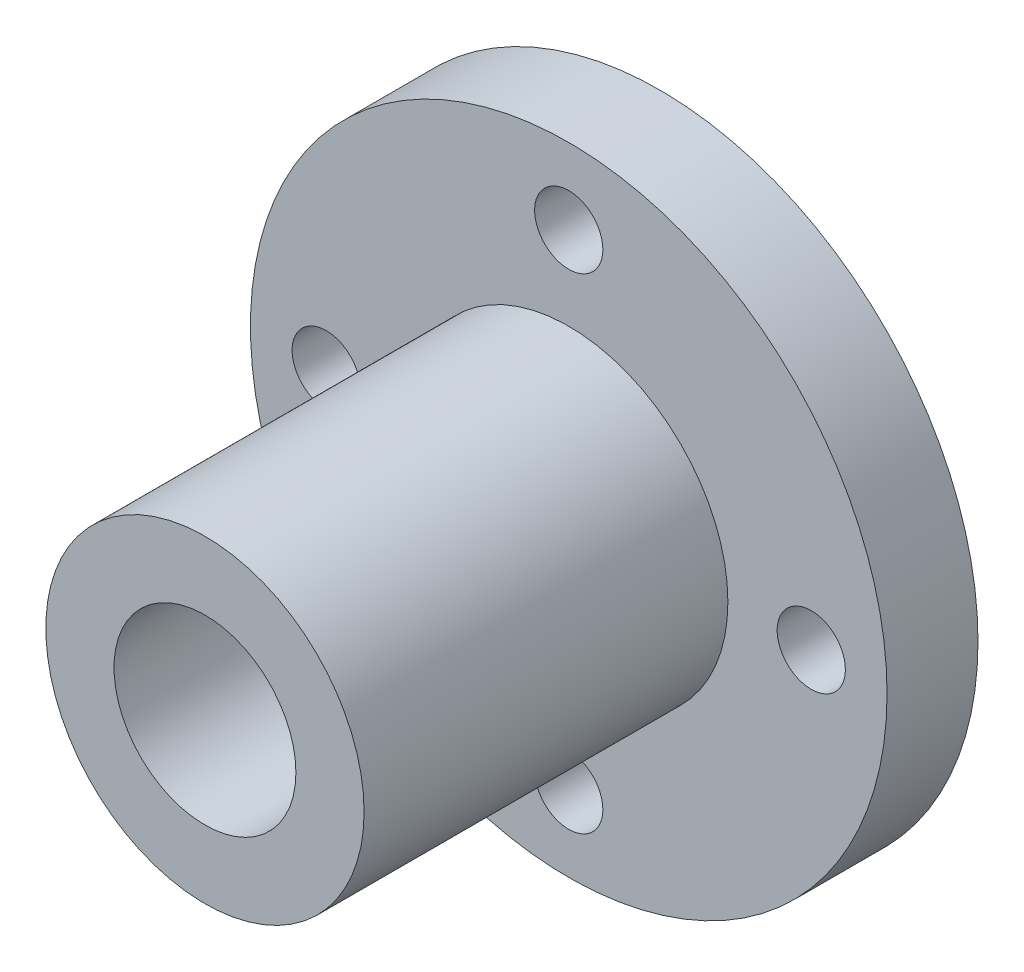
ISO-10303-21;
HEADER;
FILE_DESCRIPTION(('STEP AP214'),'2;1');
FILE_NAME('part.step','',(''),(''),'','','');
FILE_SCHEMA(('AUTOMOTIVE_DESIGN { 1 0 10303 214 1 1 1 1 }'));
ENDSEC;
DATA;
#1=APPLICATION_CONTEXT('core data for automotive mechanical design processes');
#2=APPLICATION_PROTOCOL_DEFINITION('international standard','automotive_design',2000,#1);
#3=PRODUCT_CONTEXT('',#1,'mechanical');
#4=PRODUCT('Part','Part','',(#3));
#5=PRODUCT_RELATED_PRODUCT_CATEGORY('part','',(#4));
#6=PRODUCT_DEFINITION_FORMATION('','',#4);
#7=PRODUCT_DEFINITION_CONTEXT('part definition',#1,'design');
#8=PRODUCT_DEFINITION('design','',#6,#7);
#9=PRODUCT_DEFINITION_SHAPE('','',#8);
#10=(LENGTH_UNIT() NAMED_UNIT(*) SI_UNIT(.MILLI.,.METRE.));
#11=(NAMED_UNIT(*) PLANE_ANGLE_UNIT() SI_UNIT($,.RADIAN.));
#12=(NAMED_UNIT(*) SI_UNIT($,.STERADIAN.) SOLID_ANGLE_UNIT());
#13=UNCERTAINTY_MEASURE_WITH_UNIT(LENGTH_MEASURE(1.E-05),#10,'distance_accuracy_value','');
#14=(GEOMETRIC_REPRESENTATION_CONTEXT(3) GLOBAL_UNCERTAINTY_ASSIGNED_CONTEXT((#13)) GLOBAL_UNIT_ASSIGNED_CONTEXT((#10,
#11,#12)) REPRESENTATION_CONTEXT('',''));
#15=CARTESIAN_POINT('',(0.,0.,0.));
#16=DIRECTION('',(0.,0.,1.));
#17=DIRECTION('',(1.,0.,0.));
#18=AXIS2_PLACEMENT_3D('',#15,#16,#17);
#19=CARTESIAN_POINT('',(0.,0.,6.));
#20=DIRECTION('',(0.,0.,-1.));
#21=DIRECTION('',(-1.,0.,0.));
#22=AXIS2_PLACEMENT_3D('',#19,#20,#21);
#23=CYLINDRICAL_SURFACE('',#22,21.);
#24=CARTESIAN_POINT('',(0.,0.,6.));
#25=DIRECTION('',(0.,0.,1.));
#26=DIRECTION('',(1.,0.,0.));
#27=AXIS2_PLACEMENT_3D('',#24,#25,#26);
#28=CIRCLE('',#27,21.);
#29=CARTESIAN_POINT('',(21.,0.,6.));
#30=VERTEX_POINT('',#29);
#31=EDGE_CURVE('E48',#30,#30,#28,.T.);
#32=ORIENTED_EDGE('',*,*,#31,.F.);
#33=EDGE_LOOP('',(#32));
#34=FACE_BOUND('',#33,.T.);
#35=CARTESIAN_POINT('',(0.,0.,0.));
#36=DIRECTION('',(0.,0.,1.));
#37=DIRECTION('',(1.,0.,0.));
#38=AXIS2_PLACEMENT_3D('',#35,#36,#37);
#39=CIRCLE('',#38,21.);
#40=CARTESIAN_POINT('',(21.,0.,0.));
#41=VERTEX_POINT('',#40);
#42=EDGE_CURVE('E43',#41,#41,#39,.T.);
#43=ORIENTED_EDGE('',*,*,#42,.T.);
#44=EDGE_LOOP('',(#43));
#45=FACE_BOUND('',#44,.T.);
#46=ADVANCED_FACE('F40',(#34,#45),#23,.T.);
#47=CARTESIAN_POINT('',(0.,0.,6.));
#48=DIRECTION('',(0.,0.,1.));
#49=DIRECTION('',(1.,0.,0.));
#50=AXIS2_PLACEMENT_3D('',#47,#48,#49);
#51=PLANE('',#50);
#52=CARTESIAN_POINT('',(-16.,0.,6.));
#53=DIRECTION('',(0.,0.,1.));
#54=DIRECTION('',(1.,0.,0.));
#55=AXIS2_PLACEMENT_3D('',#52,#53,#54);
#56=CIRCLE('',#55,2.25);
#57=CARTESIAN_POINT('',(-13.75,0.,6.));
#58=VERTEX_POINT('',#57);
#59=EDGE_CURVE('E92',#58,#58,#56,.T.);
#60=ORIENTED_EDGE('',*,*,#59,.F.);
#61=EDGE_LOOP('',(#60));
#62=FACE_BOUND('',#61,.T.);
#63=CARTESIAN_POINT('',(0.,16.,6.));
#64=DIRECTION('',(0.,0.,1.));
#65=DIRECTION('',(1.,0.,0.));
#66=AXIS2_PLACEMENT_3D('',#63,#64,#65);
#67=CIRCLE('',#66,2.25);
#68=CARTESIAN_POINT('',(2.25000000000006,16.,6.));
#69=VERTEX_POINT('',#68);
#70=EDGE_CURVE('E88',#69,#69,#67,.T.);
#71=ORIENTED_EDGE('',*,*,#70,.F.);
#72=EDGE_LOOP('',(#71));
#73=FACE_BOUND('',#72,.T.);
#74=CARTESIAN_POINT('',(16.,-1.1172740284298E-13,6.));
#75=DIRECTION('',(0.,0.,1.));
#76=DIRECTION('',(1.,0.,0.));
#77=AXIS2_PLACEMENT_3D('',#74,#75,#76);
#78=CIRCLE('',#77,2.25);
#79=CARTESIAN_POINT('',(18.25,-1.1172740284298E-13,6.));
#80=VERTEX_POINT('',#79);
#81=EDGE_CURVE('E80',#80,#80,#78,.T.);
#82=ORIENTED_EDGE('',*,*,#81,.F.);
#83=EDGE_LOOP('',(#82));
#84=FACE_BOUND('',#83,.T.);
#85=CARTESIAN_POINT('',(-1.6759110426447E-13,-16.,6.));
#86=DIRECTION('',(0.,0.,1.));
#87=DIRECTION('',(1.,0.,0.));
#88=AXIS2_PLACEMENT_3D('',#85,#86,#87);
#89=CIRCLE('',#88,2.25);
#90=CARTESIAN_POINT('',(2.24999999999983,-16.,6.));
#91=VERTEX_POINT('',#90);
#92=EDGE_CURVE('E72',#91,#91,#89,.T.);
#93=ORIENTED_EDGE('',*,*,#92,.F.);
#94=EDGE_LOOP('',(#93));
#95=FACE_BOUND('',#94,.T.);
#96=CARTESIAN_POINT('',(0.,0.,6.));
#97=DIRECTION('',(0.,0.,1.));
#98=DIRECTION('',(1.,0.,0.));
#99=AXIS2_PLACEMENT_3D('',#96,#97,#98);
#100=CIRCLE('',#99,10.5);
#101=CARTESIAN_POINT('',(10.5,0.,6.));
#102=VERTEX_POINT('',#101);
#103=EDGE_CURVE('E10',#102,#102,#100,.T.);
#104=ORIENTED_EDGE('',*,*,#103,.F.);
#105=EDGE_LOOP('',(#104));
#106=FACE_BOUND('',#105,.T.);
#107=ORIENTED_EDGE('',*,*,#31,.T.);
#108=EDGE_LOOP('',(#107));
#109=FACE_BOUND('',#108,.T.);
#110=ADVANCED_FACE('F110',(#62,#73,#84,#95,#106,#109),#51,.T.);
#111=CARTESIAN_POINT('',(0.,0.,0.));
#112=DIRECTION('',(0.,0.,1.));
#113=DIRECTION('',(1.,0.,0.));
#114=AXIS2_PLACEMENT_3D('',#111,#112,#113);
#115=PLANE('',#114);
#116=CARTESIAN_POINT('',(-16.,0.,0.));
#117=DIRECTION('',(0.,0.,1.));
#118=DIRECTION('',(1.,0.,0.));
#119=AXIS2_PLACEMENT_3D('',#116,#117,#118);
#120=CIRCLE('',#119,2.25);
#121=CARTESIAN_POINT('',(-13.75,0.,0.));
#122=VERTEX_POINT('',#121);
#123=EDGE_CURVE('E64',#122,#122,#120,.T.);
#124=ORIENTED_EDGE('',*,*,#123,.T.);
#125=EDGE_LOOP('',(#124));
#126=FACE_BOUND('',#125,.T.);
#127=CARTESIAN_POINT('',(0.,16.,0.));
#128=DIRECTION('',(0.,0.,1.));
#129=DIRECTION('',(1.,0.,0.));
#130=AXIS2_PLACEMENT_3D('',#127,#128,#129);
#131=CIRCLE('',#130,2.25);
#132=CARTESIAN_POINT('',(2.25000000000006,16.,0.));
#133=VERTEX_POINT('',#132);
#134=EDGE_CURVE('E84',#133,#133,#131,.T.);
#135=ORIENTED_EDGE('',*,*,#134,.T.);
#136=EDGE_LOOP('',(#135));
#137=FACE_BOUND('',#136,.T.);
#138=CARTESIAN_POINT('',(16.,-1.1172740284298E-13,0.));
#139=DIRECTION('',(0.,0.,1.));
#140=DIRECTION('',(1.,0.,0.));
#141=AXIS2_PLACEMENT_3D('',#138,#139,#140);
#142=CIRCLE('',#141,2.25);
#143=CARTESIAN_POINT('',(18.25,-1.1172740284298E-13,0.));
#144=VERTEX_POINT('',#143);
#145=EDGE_CURVE('E76',#144,#144,#142,.T.);
#146=ORIENTED_EDGE('',*,*,#145,.T.);
#147=EDGE_LOOP('',(#146));
#148=FACE_BOUND('',#147,.T.);
#149=CARTESIAN_POINT('',(-1.6759110426447E-13,-16.,0.));
#150=DIRECTION('',(0.,0.,1.));
#151=DIRECTION('',(1.,0.,0.));
#152=AXIS2_PLACEMENT_3D('',#149,#150,#151);
#153=CIRCLE('',#152,2.25);
#154=CARTESIAN_POINT('',(2.24999999999983,-16.,0.));
#155=VERTEX_POINT('',#154);
#156=EDGE_CURVE('E68',#155,#155,#153,.T.);
#157=ORIENTED_EDGE('',*,*,#156,.T.);
#158=EDGE_LOOP('',(#157));
#159=FACE_BOUND('',#158,.T.);
#160=CARTESIAN_POINT('',(0.,0.,0.));
#161=DIRECTION('',(0.,0.,1.));
#162=DIRECTION('',(1.,0.,0.));
#163=AXIS2_PLACEMENT_3D('',#160,#161,#162);
#164=CIRCLE('',#163,6.);
#165=CARTESIAN_POINT('',(6.,0.,0.));
#166=VERTEX_POINT('',#165);
#167=EDGE_CURVE('E59',#166,#166,#164,.T.);
#168=ORIENTED_EDGE('',*,*,#167,.T.);
#169=EDGE_LOOP('',(#168));
#170=FACE_BOUND('',#169,.T.);
#171=ORIENTED_EDGE('',*,*,#42,.F.);
#172=EDGE_LOOP('',(#171));
#173=FACE_BOUND('',#172,.T.);
#174=ADVANCED_FACE('F100',(#126,#137,#148,#159,#170,#173),#115,.F.);
#175=CARTESIAN_POINT('',(0.,0.,30.));
#176=DIRECTION('',(0.,0.,-1.));
#177=DIRECTION('',(-1.,0.,0.));
#178=AXIS2_PLACEMENT_3D('',#175,#176,#177);
#179=CYLINDRICAL_SURFACE('',#178,10.5);
#180=CARTESIAN_POINT('',(0.,0.,30.));
#181=DIRECTION('',(0.,0.,1.));
#182=DIRECTION('',(1.,0.,0.));
#183=AXIS2_PLACEMENT_3D('',#180,#181,#182);
#184=CIRCLE('',#183,10.5);
#185=CARTESIAN_POINT('',(10.5,0.,30.));
#186=VERTEX_POINT('',#185);
#187=EDGE_CURVE('E55',#186,#186,#184,.T.);
#188=ORIENTED_EDGE('',*,*,#187,.F.);
#189=EDGE_LOOP('',(#188));
#190=FACE_BOUND('',#189,.T.);
#191=ORIENTED_EDGE('',*,*,#103,.T.);
#192=EDGE_LOOP('',(#191));
#193=FACE_BOUND('',#192,.T.);
#194=ADVANCED_FACE('F130',(#190,#193),#179,.T.);
#195=CARTESIAN_POINT('',(0.,0.,30.));
#196=DIRECTION('',(0.,0.,1.));
#197=DIRECTION('',(1.,0.,0.));
#198=AXIS2_PLACEMENT_3D('',#195,#196,#197);
#199=PLANE('',#198);
#200=CARTESIAN_POINT('',(0.,0.,30.));
#201=DIRECTION('',(0.,0.,1.));
#202=DIRECTION('',(1.,0.,0.));
#203=AXIS2_PLACEMENT_3D('',#200,#201,#202);
#204=CIRCLE('',#203,6.);
#205=CARTESIAN_POINT('',(6.,0.,30.));
#206=VERTEX_POINT('',#205);
#207=EDGE_CURVE('E60',#206,#206,#204,.T.);
#208=ORIENTED_EDGE('',*,*,#207,.F.);
#209=EDGE_LOOP('',(#208));
#210=FACE_BOUND('',#209,.T.);
#211=ORIENTED_EDGE('',*,*,#187,.T.);
#212=EDGE_LOOP('',(#211));
#213=FACE_BOUND('',#212,.T.);
#214=ADVANCED_FACE('F134',(#210,#213),#199,.T.);
#215=CARTESIAN_POINT('',(0.,0.,0.));
#216=DIRECTION('',(0.,0.,1.));
#217=DIRECTION('',(1.,0.,0.));
#218=AXIS2_PLACEMENT_3D('',#215,#216,#217);
#219=CYLINDRICAL_SURFACE('',#218,6.);
#220=ORIENTED_EDGE('',*,*,#167,.F.);
#221=EDGE_LOOP('',(#220));
#222=FACE_BOUND('',#221,.T.);
#223=ORIENTED_EDGE('',*,*,#207,.T.);
#224=EDGE_LOOP('',(#223));
#225=FACE_BOUND('',#224,.T.);
#226=ADVANCED_FACE('F140',(#222,#225),#219,.F.);
#227=CARTESIAN_POINT('',(-1.6759110426447E-13,-16.,0.));
#228=DIRECTION('',(0.,0.,1.));
#229=DIRECTION('',(1.,0.,0.));
#230=AXIS2_PLACEMENT_3D('',#227,#228,#229);
#231=CYLINDRICAL_SURFACE('',#230,2.25);
#232=ORIENTED_EDGE('',*,*,#156,.F.);
#233=EDGE_LOOP('',(#232));
#234=FACE_BOUND('',#233,.T.);
#235=ORIENTED_EDGE('',*,*,#92,.T.);
#236=EDGE_LOOP('',(#235));
#237=FACE_BOUND('',#236,.T.);
#238=ADVANCED_FACE('F144',(#234,#237),#231,.F.);
#239=CARTESIAN_POINT('',(16.,-1.1172740284298E-13,0.));
#240=DIRECTION('',(0.,0.,1.));
#241=DIRECTION('',(1.,0.,0.));
#242=AXIS2_PLACEMENT_3D('',#239,#240,#241);
#243=CYLINDRICAL_SURFACE('',#242,2.25);
#244=ORIENTED_EDGE('',*,*,#145,.F.);
#245=EDGE_LOOP('',(#244));
#246=FACE_BOUND('',#245,.T.);
#247=ORIENTED_EDGE('',*,*,#81,.T.);
#248=EDGE_LOOP('',(#247));
#249=FACE_BOUND('',#248,.T.);
#250=ADVANCED_FACE('F148',(#246,#249),#243,.F.);
#251=CARTESIAN_POINT('',(0.,16.,0.));
#252=DIRECTION('',(0.,0.,1.));
#253=DIRECTION('',(1.,0.,0.));
#254=AXIS2_PLACEMENT_3D('',#251,#252,#253);
#255=CYLINDRICAL_SURFACE('',#254,2.25);
#256=ORIENTED_EDGE('',*,*,#134,.F.);
#257=EDGE_LOOP('',(#256));
#258=FACE_BOUND('',#257,.T.);
#259=ORIENTED_EDGE('',*,*,#70,.T.);
#260=EDGE_LOOP('',(#259));
#261=FACE_BOUND('',#260,.T.);
#262=ADVANCED_FACE('F106',(#258,#261),#255,.F.);
#263=CARTESIAN_POINT('',(-16.,0.,0.));
#264=DIRECTION('',(0.,0.,1.));
#265=DIRECTION('',(1.,0.,0.));
#266=AXIS2_PLACEMENT_3D('',#263,#264,#265);
#267=CYLINDRICAL_SURFACE('',#266,2.25);
#268=ORIENTED_EDGE('',*,*,#123,.F.);
#269=EDGE_LOOP('',(#268));
#270=FACE_BOUND('',#269,.T.);
#271=ORIENTED_EDGE('',*,*,#59,.T.);
#272=EDGE_LOOP('',(#271));
#273=FACE_BOUND('',#272,.T.);
#274=ADVANCED_FACE('F103',(#270,#273),#267,.F.);
#275=CLOSED_SHELL('',(#46,#110,#174,#194,#214,#226,#238,#250,#262,#274));
#276=MANIFOLD_SOLID_BREP('B2',#275);
#277=ADVANCED_BREP_SHAPE_REPRESENTATION('',(#18,#276),#14);
#278=SHAPE_DEFINITION_REPRESENTATION(#9,#277);
ENDSEC;
END-ISO-10303-21;
